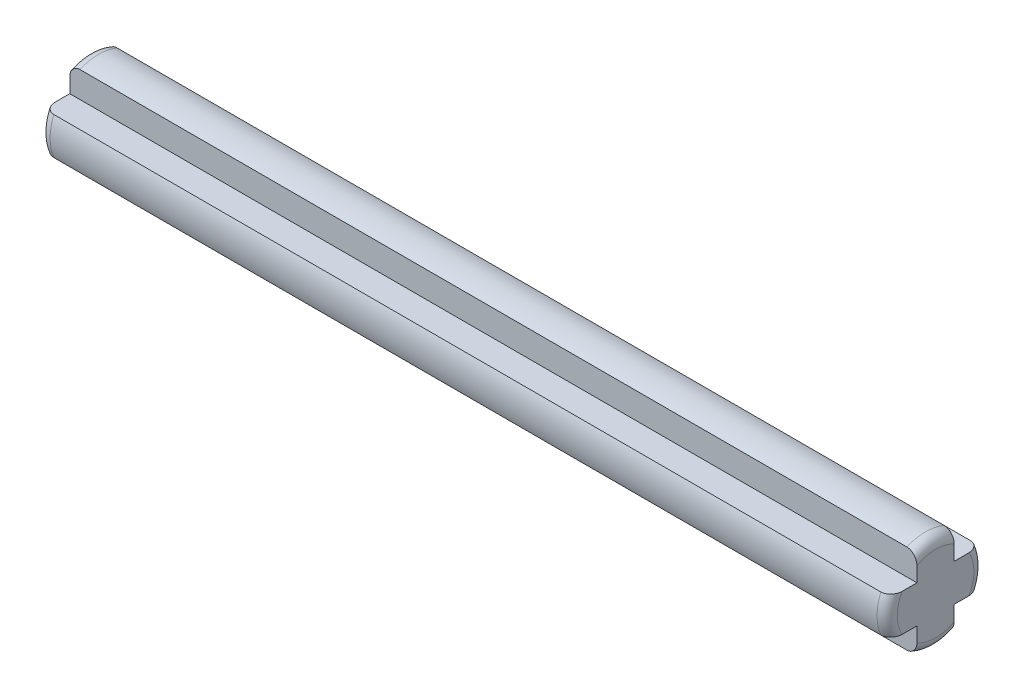
ISO-10303-21;
HEADER;
FILE_DESCRIPTION(('STEP AP214'),'2;1');
FILE_NAME('part.step','',(''),(''),'','','');
FILE_SCHEMA(('AUTOMOTIVE_DESIGN { 1 0 10303 214 1 1 1 1 }'));
ENDSEC;
DATA;
#1=APPLICATION_CONTEXT('core data for automotive mechanical design processes');
#2=APPLICATION_PROTOCOL_DEFINITION('international standard','automotive_design',2000,#1);
#3=PRODUCT_CONTEXT('',#1,'mechanical');
#4=PRODUCT('Part','Part','',(#3));
#5=PRODUCT_RELATED_PRODUCT_CATEGORY('part','',(#4));
#6=PRODUCT_DEFINITION_FORMATION('','',#4);
#7=PRODUCT_DEFINITION_CONTEXT('part definition',#1,'design');
#8=PRODUCT_DEFINITION('design','',#6,#7);
#9=PRODUCT_DEFINITION_SHAPE('','',#8);
#10=(LENGTH_UNIT() NAMED_UNIT(*) SI_UNIT(.MILLI.,.METRE.));
#11=(NAMED_UNIT(*) PLANE_ANGLE_UNIT() SI_UNIT($,.RADIAN.));
#12=(NAMED_UNIT(*) SI_UNIT($,.STERADIAN.) SOLID_ANGLE_UNIT());
#13=UNCERTAINTY_MEASURE_WITH_UNIT(LENGTH_MEASURE(1.E-05),#10,'distance_accuracy_value','');
#14=(GEOMETRIC_REPRESENTATION_CONTEXT(3) GLOBAL_UNCERTAINTY_ASSIGNED_CONTEXT((#13)) GLOBAL_UNIT_ASSIGNED_CONTEXT((#10,
#11,#12)) REPRESENTATION_CONTEXT('',''));
#15=CARTESIAN_POINT('',(0.,0.,0.));
#16=DIRECTION('',(0.,0.,1.));
#17=DIRECTION('',(1.,0.,0.));
#18=AXIS2_PLACEMENT_3D('',#15,#16,#17);
#19=CARTESIAN_POINT('',(41.5,0.,0.));
#20=DIRECTION('',(1.,0.,0.));
#21=DIRECTION('',(0.,1.,0.));
#22=AXIS2_PLACEMENT_3D('',#19,#20,#21);
#23=TOROIDAL_SURFACE('',#22,1.9,0.5);
#24=CARTESIAN_POINT('',(41.5,-2.2145823534021,0.925));
#25=CARTESIAN_POINT('',(41.7036798991296,-2.2145823534021,0.925));
#26=CARTESIAN_POINT('',(41.8548300320378,-2.04164291184524,0.925));
#27=CARTESIAN_POINT('',(42.,-1.875545716248,0.925));
#28=CARTESIAN_POINT('',(42.,-1.65963098308027,0.925));
#29=B_SPLINE_CURVE_WITH_KNOTS('',2,(#24,#25,#26,#27,#28),.UNSPECIFIED.,.F.,.F.,(3,2,3),(0.,0.5,
1.),.UNSPECIFIED.);
#30=CARTESIAN_POINT('',(41.5,-2.2145823534021,0.925));
#31=VERTEX_POINT('',#30);
#32=CARTESIAN_POINT('',(42.,-1.65963098308028,0.925));
#33=VERTEX_POINT('',#32);
#34=EDGE_CURVE('E732',#31,#33,#29,.T.);
#35=ORIENTED_EDGE('',*,*,#34,.F.);
#36=CARTESIAN_POINT('',(41.5,0.,0.));
#37=DIRECTION('',(-1.,0.,0.));
#38=DIRECTION('',(0.,1.,0.));
#39=AXIS2_PLACEMENT_3D('',#36,#37,#38);
#40=CIRCLE('',#39,2.4);
#41=CARTESIAN_POINT('',(41.5,-2.2145823534021,-0.925));
#42=VERTEX_POINT('',#41);
#43=EDGE_CURVE('E808',#42,#31,#40,.T.);
#44=ORIENTED_EDGE('',*,*,#43,.F.);
#45=CARTESIAN_POINT('',(42.,-1.65963098308028,-0.925));
#46=CARTESIAN_POINT('',(42.,-1.87313664786722,-0.925));
#47=CARTESIAN_POINT('',(41.8550835363971,-2.04178590647879,-0.925));
#48=CARTESIAN_POINT('',(41.7066034884122,-2.21458235340213,-0.925));
#49=CARTESIAN_POINT('',(41.5,-2.21458235340213,-0.925));
#50=B_SPLINE_CURVE_WITH_KNOTS('',2,(#45,#46,#47,#48,#49),.UNSPECIFIED.,.F.,.F.,(3,2,3),(0.,0.5,
1.),.UNSPECIFIED.);
#51=CARTESIAN_POINT('',(42.,-1.65963098308028,-0.925));
#52=VERTEX_POINT('',#51);
#53=EDGE_CURVE('E876',#52,#42,#50,.T.);
#54=ORIENTED_EDGE('',*,*,#53,.F.);
#55=CARTESIAN_POINT('',(42.,0.,0.));
#56=DIRECTION('',(1.,0.,0.));
#57=DIRECTION('',(0.,1.,0.));
#58=AXIS2_PLACEMENT_3D('',#55,#56,#57);
#59=CIRCLE('',#58,1.9);
#60=EDGE_CURVE('E606',#33,#52,#59,.T.);
#61=ORIENTED_EDGE('',*,*,#60,.F.);
#62=EDGE_LOOP('',(#35,#44,#54,#61));
#63=FACE_BOUND('',#62,.T.);
#64=ADVANCED_FACE('F16',(#63),#23,.T.);
#65=CARTESIAN_POINT('',(41.5,0.,0.));
#66=DIRECTION('',(1.,0.,0.));
#67=DIRECTION('',(0.,1.,0.));
#68=AXIS2_PLACEMENT_3D('',#65,#66,#67);
#69=TOROIDAL_SURFACE('',#68,1.9,0.5);
#70=CARTESIAN_POINT('',(41.5,0.925,2.2145823534021));
#71=CARTESIAN_POINT('',(41.7036798991296,0.925,2.2145823534021));
#72=CARTESIAN_POINT('',(41.8548300320378,0.925,2.04164291184524));
#73=CARTESIAN_POINT('',(42.,0.925,1.875545716248));
#74=CARTESIAN_POINT('',(42.,0.925,1.65963098308027));
#75=B_SPLINE_CURVE_WITH_KNOTS('',2,(#70,#71,#72,#73,#74),.UNSPECIFIED.,.F.,.F.,(3,2,3),(0.,0.5,
1.),.UNSPECIFIED.);
#76=CARTESIAN_POINT('',(41.5,0.925,2.2145823534021));
#77=VERTEX_POINT('',#76);
#78=CARTESIAN_POINT('',(42.,0.925,1.65963098308027));
#79=VERTEX_POINT('',#78);
#80=EDGE_CURVE('E640',#77,#79,#75,.T.);
#81=ORIENTED_EDGE('',*,*,#80,.F.);
#82=CARTESIAN_POINT('',(41.5,0.,0.));
#83=DIRECTION('',(-1.,0.,0.));
#84=DIRECTION('',(0.,1.,0.));
#85=AXIS2_PLACEMENT_3D('',#82,#83,#84);
#86=CIRCLE('',#85,2.4);
#87=CARTESIAN_POINT('',(41.5,-0.925,2.2145823534021));
#88=VERTEX_POINT('',#87);
#89=EDGE_CURVE('E623',#88,#77,#86,.T.);
#90=ORIENTED_EDGE('',*,*,#89,.F.);
#91=CARTESIAN_POINT('',(42.,-0.925,1.65963098308027));
#92=CARTESIAN_POINT('',(42.,-0.925,1.87313664786717));
#93=CARTESIAN_POINT('',(41.8550835363971,-0.925,2.04178590647878));
#94=CARTESIAN_POINT('',(41.7066034884122,-0.925,2.21458235340213));
#95=CARTESIAN_POINT('',(41.5,-0.925,2.21458235340213));
#96=B_SPLINE_CURVE_WITH_KNOTS('',2,(#91,#92,#93,#94,#95),.UNSPECIFIED.,.F.,.F.,(3,2,3),(0.,0.5,
1.),.UNSPECIFIED.);
#97=CARTESIAN_POINT('',(42.,-0.925,1.65963098308027));
#98=VERTEX_POINT('',#97);
#99=EDGE_CURVE('E307',#98,#88,#96,.T.);
#100=ORIENTED_EDGE('',*,*,#99,.F.);
#101=CARTESIAN_POINT('',(42.,0.,0.));
#102=DIRECTION('',(1.,0.,0.));
#103=DIRECTION('',(0.,1.,0.));
#104=AXIS2_PLACEMENT_3D('',#101,#102,#103);
#105=CIRCLE('',#104,1.9);
#106=EDGE_CURVE('E39',#79,#98,#105,.T.);
#107=ORIENTED_EDGE('',*,*,#106,.F.);
#108=EDGE_LOOP('',(#81,#90,#100,#107));
#109=FACE_BOUND('',#108,.T.);
#110=ADVANCED_FACE('F671',(#109),#69,.T.);
#111=CARTESIAN_POINT('',(41.5,0.,0.));
#112=DIRECTION('',(1.,0.,0.));
#113=DIRECTION('',(0.,1.,0.));
#114=AXIS2_PLACEMENT_3D('',#111,#112,#113);
#115=TOROIDAL_SURFACE('',#114,1.9,0.5);
#116=CARTESIAN_POINT('',(41.5,2.2145823534021,-0.925));
#117=CARTESIAN_POINT('',(41.7036798991296,2.2145823534021,-0.925));
#118=CARTESIAN_POINT('',(41.8548300320378,2.04164291184524,-0.925));
#119=CARTESIAN_POINT('',(42.,1.875545716248,-0.925));
#120=CARTESIAN_POINT('',(42.,1.65963098308027,-0.925));
#121=B_SPLINE_CURVE_WITH_KNOTS('',2,(#116,#117,#118,#119,#120),.UNSPECIFIED.,.F.,.F.,(3,2,3),
(0.,0.5,1.),.UNSPECIFIED.);
#122=CARTESIAN_POINT('',(41.5,2.2145823534021,-0.925));
#123=VERTEX_POINT('',#122);
#124=CARTESIAN_POINT('',(42.,1.65963098308027,-0.925));
#125=VERTEX_POINT('',#124);
#126=EDGE_CURVE('E411',#123,#125,#121,.T.);
#127=ORIENTED_EDGE('',*,*,#126,.F.);
#128=CARTESIAN_POINT('',(41.5,0.,0.));
#129=DIRECTION('',(-1.,0.,0.));
#130=DIRECTION('',(0.,1.,0.));
#131=AXIS2_PLACEMENT_3D('',#128,#129,#130);
#132=CIRCLE('',#131,2.4);
#133=CARTESIAN_POINT('',(41.5,2.2145823534021,0.925));
#134=VERTEX_POINT('',#133);
#135=EDGE_CURVE('E443',#134,#123,#132,.T.);
#136=ORIENTED_EDGE('',*,*,#135,.F.);
#137=CARTESIAN_POINT('',(42.,1.65963098308027,0.925));
#138=CARTESIAN_POINT('',(42.,1.87313664786717,0.925));
#139=CARTESIAN_POINT('',(41.8550835363971,2.04178590647878,0.925));
#140=CARTESIAN_POINT('',(41.7066034884122,2.21458235340213,0.925));
#141=CARTESIAN_POINT('',(41.5,2.21458235340213,0.925));
#142=B_SPLINE_CURVE_WITH_KNOTS('',2,(#137,#138,#139,#140,#141),.UNSPECIFIED.,.F.,.F.,(3,2,3),
(0.,0.5,1.),.UNSPECIFIED.);
#143=CARTESIAN_POINT('',(42.,1.65963098308027,0.925));
#144=VERTEX_POINT('',#143);
#145=EDGE_CURVE('E504',#144,#134,#142,.T.);
#146=ORIENTED_EDGE('',*,*,#145,.F.);
#147=CARTESIAN_POINT('',(42.,0.,0.));
#148=DIRECTION('',(1.,0.,0.));
#149=DIRECTION('',(0.,1.,0.));
#150=AXIS2_PLACEMENT_3D('',#147,#148,#149);
#151=CIRCLE('',#150,1.9);
#152=EDGE_CURVE('E306',#125,#144,#151,.T.);
#153=ORIENTED_EDGE('',*,*,#152,.F.);
#154=EDGE_LOOP('',(#127,#136,#146,#153));
#155=FACE_BOUND('',#154,.T.);
#156=ADVANCED_FACE('F285',(#155),#115,.T.);
#157=CARTESIAN_POINT('',(41.5,0.,0.));
#158=DIRECTION('',(1.,0.,0.));
#159=DIRECTION('',(0.,1.,0.));
#160=AXIS2_PLACEMENT_3D('',#157,#158,#159);
#161=TOROIDAL_SURFACE('',#160,1.9,0.5);
#162=CARTESIAN_POINT('',(41.5,-0.925,-2.2145823534021));
#163=CARTESIAN_POINT('',(41.7036798991296,-0.925,-2.2145823534021));
#164=CARTESIAN_POINT('',(41.8548300320378,-0.925,-2.04164291184524));
#165=CARTESIAN_POINT('',(42.,-0.925,-1.875545716248));
#166=CARTESIAN_POINT('',(42.,-0.925,-1.65963098308027));
#167=B_SPLINE_CURVE_WITH_KNOTS('',2,(#162,#163,#164,#165,#166),.UNSPECIFIED.,.F.,.F.,(3,2,3),
(0.,0.5,1.),.UNSPECIFIED.);
#168=CARTESIAN_POINT('',(41.5,-0.925,-2.2145823534021));
#169=VERTEX_POINT('',#168);
#170=CARTESIAN_POINT('',(42.,-0.925,-1.65963098308027));
#171=VERTEX_POINT('',#170);
#172=EDGE_CURVE('E227',#169,#171,#167,.T.);
#173=ORIENTED_EDGE('',*,*,#172,.F.);
#174=CARTESIAN_POINT('',(41.5,0.,0.));
#175=DIRECTION('',(-1.,0.,0.));
#176=DIRECTION('',(0.,1.,0.));
#177=AXIS2_PLACEMENT_3D('',#174,#175,#176);
#178=CIRCLE('',#177,2.4);
#179=CARTESIAN_POINT('',(41.5,0.925,-2.2145823534021));
#180=VERTEX_POINT('',#179);
#181=EDGE_CURVE('E222',#180,#169,#178,.T.);
#182=ORIENTED_EDGE('',*,*,#181,.F.);
#183=CARTESIAN_POINT('',(42.,0.925,-1.65963098308027));
#184=CARTESIAN_POINT('',(42.,0.925,-1.87313664786717));
#185=CARTESIAN_POINT('',(41.8550835363971,0.925,-2.04178590647878));
#186=CARTESIAN_POINT('',(41.7066034884122,0.925,-2.21458235340213));
#187=CARTESIAN_POINT('',(41.5,0.925,-2.21458235340213));
#188=B_SPLINE_CURVE_WITH_KNOTS('',2,(#183,#184,#185,#186,#187),.UNSPECIFIED.,.F.,.F.,(3,2,3),
(0.,0.5,1.),.UNSPECIFIED.);
#189=CARTESIAN_POINT('',(42.,0.925,-1.65963098308027));
#190=VERTEX_POINT('',#189);
#191=EDGE_CURVE('E314',#190,#180,#188,.T.);
#192=ORIENTED_EDGE('',*,*,#191,.F.);
#193=CARTESIAN_POINT('',(42.,0.,0.));
#194=DIRECTION('',(1.,0.,0.));
#195=DIRECTION('',(0.,1.,0.));
#196=AXIS2_PLACEMENT_3D('',#193,#194,#195);
#197=CIRCLE('',#196,1.9);
#198=EDGE_CURVE('E298',#171,#190,#197,.T.);
#199=ORIENTED_EDGE('',*,*,#198,.F.);
#200=EDGE_LOOP('',(#173,#182,#192,#199));
#201=FACE_BOUND('',#200,.T.);
#202=ADVANCED_FACE('F275',(#201),#161,.T.);
#203=CARTESIAN_POINT('',(0.5,0.,0.));
#204=DIRECTION('',(1.,0.,0.));
#205=DIRECTION('',(0.,1.,0.));
#206=AXIS2_PLACEMENT_3D('',#203,#204,#205);
#207=TOROIDAL_SURFACE('',#206,1.9,0.5);
#208=CARTESIAN_POINT('',(0.,-0.925,-1.65963098308027));
#209=CARTESIAN_POINT('',(0.,-0.925,-1.87313664786714));
#210=CARTESIAN_POINT('',(0.144916463602852,-0.925,-2.04178590647878));
#211=CARTESIAN_POINT('',(0.293396511587753,-0.925,-2.21458235340213));
#212=CARTESIAN_POINT('',(0.5,-0.925,-2.21458235340213));
#213=B_SPLINE_CURVE_WITH_KNOTS('',2,(#208,#209,#210,#211,#212),.UNSPECIFIED.,.F.,.F.,(3,2,3),
(0.,0.5,1.),.UNSPECIFIED.);
#214=CARTESIAN_POINT('',(0.,-0.925,-1.65963098308027));
#215=VERTEX_POINT('',#214);
#216=CARTESIAN_POINT('',(0.500000000000007,-0.925,-2.2145823534021));
#217=VERTEX_POINT('',#216);
#218=EDGE_CURVE('E205',#215,#217,#213,.T.);
#219=ORIENTED_EDGE('',*,*,#218,.F.);
#220=CARTESIAN_POINT('',(0.,0.,0.));
#221=DIRECTION('',(-1.,0.,0.));
#222=DIRECTION('',(0.,1.,0.));
#223=AXIS2_PLACEMENT_3D('',#220,#221,#222);
#224=CIRCLE('',#223,1.9);
#225=CARTESIAN_POINT('',(0.,0.925,-1.65963098308027));
#226=VERTEX_POINT('',#225);
#227=EDGE_CURVE('E10',#226,#215,#224,.T.);
#228=ORIENTED_EDGE('',*,*,#227,.F.);
#229=CARTESIAN_POINT('',(0.5,0.925,-2.2145823534021));
#230=CARTESIAN_POINT('',(0.296320100870356,0.925,-2.2145823534021));
#231=CARTESIAN_POINT('',(0.145169967962148,0.925,-2.04164291184524));
#232=CARTESIAN_POINT('',(0.,0.925,-1.87554571624801));
#233=CARTESIAN_POINT('',(0.,0.925,-1.65963098308027));
#234=B_SPLINE_CURVE_WITH_KNOTS('',2,(#229,#230,#231,#232,#233),.UNSPECIFIED.,.F.,.F.,(3,2,3),
(0.,0.5,1.),.UNSPECIFIED.);
#235=CARTESIAN_POINT('',(0.500000000000007,0.925,-2.2145823534021));
#236=VERTEX_POINT('',#235);
#237=EDGE_CURVE('E209',#236,#226,#234,.T.);
#238=ORIENTED_EDGE('',*,*,#237,.F.);
#239=CARTESIAN_POINT('',(0.499999999999994,0.,0.));
#240=DIRECTION('',(1.,0.,0.));
#241=DIRECTION('',(0.,1.,0.));
#242=AXIS2_PLACEMENT_3D('',#239,#240,#241);
#243=CIRCLE('',#242,2.4);
#244=EDGE_CURVE('E201',#217,#236,#243,.T.);
#245=ORIENTED_EDGE('',*,*,#244,.F.);
#246=EDGE_LOOP('',(#219,#228,#238,#245));
#247=FACE_BOUND('',#246,.T.);
#248=ADVANCED_FACE('F203',(#247),#207,.T.);
#249=CARTESIAN_POINT('',(0.5,0.,0.));
#250=DIRECTION('',(1.,0.,0.));
#251=DIRECTION('',(0.,1.,0.));
#252=AXIS2_PLACEMENT_3D('',#249,#250,#251);
#253=TOROIDAL_SURFACE('',#252,1.9,0.5);
#254=CARTESIAN_POINT('',(0.,1.65963098308027,-0.925));
#255=CARTESIAN_POINT('',(0.,1.87313664786714,-0.925));
#256=CARTESIAN_POINT('',(0.144916463602852,2.04178590647878,-0.925));
#257=CARTESIAN_POINT('',(0.293396511587753,2.21458235340213,-0.925));
#258=CARTESIAN_POINT('',(0.5,2.21458235340213,-0.925));
#259=B_SPLINE_CURVE_WITH_KNOTS('',2,(#254,#255,#256,#257,#258),.UNSPECIFIED.,.F.,.F.,(3,2,3),
(0.,0.5,1.),.UNSPECIFIED.);
#260=CARTESIAN_POINT('',(0.,1.65963098308027,-0.925));
#261=VERTEX_POINT('',#260);
#262=CARTESIAN_POINT('',(0.500000000000007,2.2145823534021,-0.925));
#263=VERTEX_POINT('',#262);
#264=EDGE_CURVE('E362',#261,#263,#259,.T.);
#265=ORIENTED_EDGE('',*,*,#264,.F.);
#266=CARTESIAN_POINT('',(0.,0.,0.));
#267=DIRECTION('',(-1.,0.,0.));
#268=DIRECTION('',(0.,1.,0.));
#269=AXIS2_PLACEMENT_3D('',#266,#267,#268);
#270=CIRCLE('',#269,1.9);
#271=CARTESIAN_POINT('',(0.,1.65963098308027,0.925));
#272=VERTEX_POINT('',#271);
#273=EDGE_CURVE('E26',#272,#261,#270,.T.);
#274=ORIENTED_EDGE('',*,*,#273,.F.);
#275=CARTESIAN_POINT('',(0.5,2.2145823534021,0.925));
#276=CARTESIAN_POINT('',(0.296320100870356,2.2145823534021,0.925));
#277=CARTESIAN_POINT('',(0.145169967962148,2.04164291184524,0.925));
#278=CARTESIAN_POINT('',(0.,1.87554571624801,0.925));
#279=CARTESIAN_POINT('',(0.,1.65963098308027,0.925));
#280=B_SPLINE_CURVE_WITH_KNOTS('',2,(#275,#276,#277,#278,#279),.UNSPECIFIED.,.F.,.F.,(3,2,3),
(0.,0.5,1.),.UNSPECIFIED.);
#281=CARTESIAN_POINT('',(0.500000000000007,2.2145823534021,0.925));
#282=VERTEX_POINT('',#281);
#283=EDGE_CURVE('E447',#282,#272,#280,.T.);
#284=ORIENTED_EDGE('',*,*,#283,.F.);
#285=CARTESIAN_POINT('',(0.499999999999994,0.,0.));
#286=DIRECTION('',(1.,0.,0.));
#287=DIRECTION('',(0.,1.,0.));
#288=AXIS2_PLACEMENT_3D('',#285,#286,#287);
#289=CIRCLE('',#288,2.4);
#290=EDGE_CURVE('E430',#263,#282,#289,.T.);
#291=ORIENTED_EDGE('',*,*,#290,.F.);
#292=EDGE_LOOP('',(#265,#274,#284,#291));
#293=FACE_BOUND('',#292,.T.);
#294=ADVANCED_FACE('F286',(#293),#253,.T.);
#295=CARTESIAN_POINT('',(0.5,0.,0.));
#296=DIRECTION('',(1.,0.,0.));
#297=DIRECTION('',(0.,1.,0.));
#298=AXIS2_PLACEMENT_3D('',#295,#296,#297);
#299=TOROIDAL_SURFACE('',#298,1.9,0.5);
#300=CARTESIAN_POINT('',(0.,0.925,1.65963098308027));
#301=CARTESIAN_POINT('',(0.,0.925,1.87313664786714));
#302=CARTESIAN_POINT('',(0.144916463602852,0.925,2.04178590647878));
#303=CARTESIAN_POINT('',(0.293396511587753,0.925,2.21458235340213));
#304=CARTESIAN_POINT('',(0.5,0.925,2.21458235340213));
#305=B_SPLINE_CURVE_WITH_KNOTS('',2,(#300,#301,#302,#303,#304),.UNSPECIFIED.,.F.,.F.,(3,2,3),
(0.,0.5,1.),.UNSPECIFIED.);
#306=CARTESIAN_POINT('',(0.,0.925,1.65963098308027));
#307=VERTEX_POINT('',#306);
#308=CARTESIAN_POINT('',(0.500000000000007,0.925,2.2145823534021));
#309=VERTEX_POINT('',#308);
#310=EDGE_CURVE('E579',#307,#309,#305,.T.);
#311=ORIENTED_EDGE('',*,*,#310,.F.);
#312=CARTESIAN_POINT('',(0.,0.,0.));
#313=DIRECTION('',(-1.,0.,0.));
#314=DIRECTION('',(0.,1.,0.));
#315=AXIS2_PLACEMENT_3D('',#312,#313,#314);
#316=CIRCLE('',#315,1.9);
#317=CARTESIAN_POINT('',(0.,-0.925,1.65963098308027));
#318=VERTEX_POINT('',#317);
#319=EDGE_CURVE('E49',#318,#307,#316,.T.);
#320=ORIENTED_EDGE('',*,*,#319,.F.);
#321=CARTESIAN_POINT('',(0.5,-0.925,2.2145823534021));
#322=CARTESIAN_POINT('',(0.296320100870356,-0.925,2.2145823534021));
#323=CARTESIAN_POINT('',(0.145169967962148,-0.925,2.04164291184524));
#324=CARTESIAN_POINT('',(0.,-0.925,1.87554571624801));
#325=CARTESIAN_POINT('',(0.,-0.925,1.65963098308027));
#326=B_SPLINE_CURVE_WITH_KNOTS('',2,(#321,#322,#323,#324,#325),.UNSPECIFIED.,.F.,.F.,(3,2,3),
(0.,0.5,1.),.UNSPECIFIED.);
#327=CARTESIAN_POINT('',(0.500000000000007,-0.925,2.2145823534021));
#328=VERTEX_POINT('',#327);
#329=EDGE_CURVE('E546',#328,#318,#326,.T.);
#330=ORIENTED_EDGE('',*,*,#329,.F.);
#331=CARTESIAN_POINT('',(0.499999999999994,0.,0.));
#332=DIRECTION('',(1.,0.,0.));
#333=DIRECTION('',(0.,1.,0.));
#334=AXIS2_PLACEMENT_3D('',#331,#332,#333);
#335=CIRCLE('',#334,2.4);
#336=EDGE_CURVE('E550',#309,#328,#335,.T.);
#337=ORIENTED_EDGE('',*,*,#336,.F.);
#338=EDGE_LOOP('',(#311,#320,#330,#337));
#339=FACE_BOUND('',#338,.T.);
#340=ADVANCED_FACE('F552',(#339),#299,.T.);
#341=CARTESIAN_POINT('',(0.5,0.,0.));
#342=DIRECTION('',(1.,0.,0.));
#343=DIRECTION('',(0.,1.,0.));
#344=AXIS2_PLACEMENT_3D('',#341,#342,#343);
#345=TOROIDAL_SURFACE('',#344,1.9,0.5);
#346=CARTESIAN_POINT('',(0.,-1.65963098308028,0.925));
#347=CARTESIAN_POINT('',(0.,-1.87313664786714,0.925));
#348=CARTESIAN_POINT('',(0.144916463602852,-2.04178590647879,0.925));
#349=CARTESIAN_POINT('',(0.293396511587753,-2.21458235340213,0.925));
#350=CARTESIAN_POINT('',(0.5,-2.21458235340213,0.925));
#351=B_SPLINE_CURVE_WITH_KNOTS('',2,(#346,#347,#348,#349,#350),.UNSPECIFIED.,.F.,.F.,(3,2,3),
(0.,0.5,1.),.UNSPECIFIED.);
#352=CARTESIAN_POINT('',(0.,-1.65963098308028,0.925));
#353=VERTEX_POINT('',#352);
#354=CARTESIAN_POINT('',(0.500000000000007,-2.2145823534021,0.925));
#355=VERTEX_POINT('',#354);
#356=EDGE_CURVE('E755',#353,#355,#351,.T.);
#357=ORIENTED_EDGE('',*,*,#356,.F.);
#358=CARTESIAN_POINT('',(0.,0.,0.));
#359=DIRECTION('',(-1.,0.,0.));
#360=DIRECTION('',(0.,1.,0.));
#361=AXIS2_PLACEMENT_3D('',#358,#359,#360);
#362=CIRCLE('',#361,1.9);
#363=CARTESIAN_POINT('',(0.,-1.65963098308028,-0.925));
#364=VERTEX_POINT('',#363);
#365=EDGE_CURVE('E610',#364,#353,#362,.T.);
#366=ORIENTED_EDGE('',*,*,#365,.F.);
#367=CARTESIAN_POINT('',(0.5,-2.2145823534021,-0.925));
#368=CARTESIAN_POINT('',(0.296320100870356,-2.2145823534021,-0.925));
#369=CARTESIAN_POINT('',(0.145169967962148,-2.04164291184524,-0.925));
#370=CARTESIAN_POINT('',(0.,-1.87554571624801,-0.925));
#371=CARTESIAN_POINT('',(0.,-1.65963098308027,-0.925));
#372=B_SPLINE_CURVE_WITH_KNOTS('',2,(#367,#368,#369,#370,#371),.UNSPECIFIED.,.F.,.F.,(3,2,3),
(0.,0.5,1.),.UNSPECIFIED.);
#373=CARTESIAN_POINT('',(0.500000000000007,-2.2145823534021,-0.925));
#374=VERTEX_POINT('',#373);
#375=EDGE_CURVE('E723',#374,#364,#372,.T.);
#376=ORIENTED_EDGE('',*,*,#375,.F.);
#377=CARTESIAN_POINT('',(0.499999999999994,0.,0.));
#378=DIRECTION('',(1.,0.,0.));
#379=DIRECTION('',(0.,1.,0.));
#380=AXIS2_PLACEMENT_3D('',#377,#378,#379);
#381=CIRCLE('',#380,2.4);
#382=EDGE_CURVE('E793',#355,#374,#381,.T.);
#383=ORIENTED_EDGE('',*,*,#382,.F.);
#384=EDGE_LOOP('',(#357,#366,#376,#383));
#385=FACE_BOUND('',#384,.T.);
#386=ADVANCED_FACE('F561',(#385),#345,.T.);
#387=CARTESIAN_POINT('',(0.,0.,0.));
#388=DIRECTION('',(1.,0.,0.));
#389=DIRECTION('',(0.,1.,0.));
#390=AXIS2_PLACEMENT_3D('',#387,#388,#389);
#391=PLANE('',#390);
#392=DIRECTION('',(0.,1.,0.));
#393=VECTOR('',#392,1.);
#394=CARTESIAN_POINT('',(0.,-2.2145823534021,-0.925));
#395=LINE('',#394,#393);
#396=CARTESIAN_POINT('',(0.,-0.925,-0.925));
#397=VERTEX_POINT('',#396);
#398=EDGE_CURVE('E718',#364,#397,#395,.T.);
#399=ORIENTED_EDGE('',*,*,#398,.F.);
#400=ORIENTED_EDGE('',*,*,#365,.T.);
#401=DIRECTION('',(0.,-1.,0.));
#402=VECTOR('',#401,1.);
#403=CARTESIAN_POINT('',(0.,-2.2145823534021,0.925));
#404=LINE('',#403,#402);
#405=CARTESIAN_POINT('',(0.,-0.925,0.925));
#406=VERTEX_POINT('',#405);
#407=EDGE_CURVE('E779',#406,#353,#404,.T.);
#408=ORIENTED_EDGE('',*,*,#407,.F.);
#409=DIRECTION('',(0.,0.,-1.));
#410=VECTOR('',#409,1.);
#411=CARTESIAN_POINT('',(0.,-0.925,0.925));
#412=LINE('',#411,#410);
#413=EDGE_CURVE('E620',#318,#406,#412,.T.);
#414=ORIENTED_EDGE('',*,*,#413,.F.);
#415=ORIENTED_EDGE('',*,*,#319,.T.);
#416=DIRECTION('',(0.,0.,1.));
#417=VECTOR('',#416,1.);
#418=CARTESIAN_POINT('',(0.,0.925,0.925));
#419=LINE('',#418,#417);
#420=CARTESIAN_POINT('',(0.,0.925,0.925));
#421=VERTEX_POINT('',#420);
#422=EDGE_CURVE('E571',#421,#307,#419,.T.);
#423=ORIENTED_EDGE('',*,*,#422,.F.);
#424=DIRECTION('',(0.,-1.,0.));
#425=VECTOR('',#424,1.);
#426=CARTESIAN_POINT('',(0.,0.925,0.925));
#427=LINE('',#426,#425);
#428=EDGE_CURVE('E453',#272,#421,#427,.T.);
#429=ORIENTED_EDGE('',*,*,#428,.F.);
#430=ORIENTED_EDGE('',*,*,#273,.T.);
#431=DIRECTION('',(0.,1.,0.));
#432=VECTOR('',#431,1.);
#433=CARTESIAN_POINT('',(0.,0.925,-0.925));
#434=LINE('',#433,#432);
#435=CARTESIAN_POINT('',(0.,0.925,-0.925));
#436=VERTEX_POINT('',#435);
#437=EDGE_CURVE('E358',#436,#261,#434,.T.);
#438=ORIENTED_EDGE('',*,*,#437,.F.);
#439=DIRECTION('',(0.,0.,1.));
#440=VECTOR('',#439,1.);
#441=CARTESIAN_POINT('',(0.,0.925,-2.2145823534021));
#442=LINE('',#441,#440);
#443=EDGE_CURVE('E927',#226,#436,#442,.T.);
#444=ORIENTED_EDGE('',*,*,#443,.F.);
#445=ORIENTED_EDGE('',*,*,#227,.T.);
#446=DIRECTION('',(0.,0.,-1.));
#447=VECTOR('',#446,1.);
#448=CARTESIAN_POINT('',(0.,-0.925,-2.2145823534021));
#449=LINE('',#448,#447);
#450=EDGE_CURVE('E232',#397,#215,#449,.T.);
#451=ORIENTED_EDGE('',*,*,#450,.F.);
#452=EDGE_LOOP('',(#399,#400,#408,#414,#415,#423,#429,#430,#438,#444,#445,#451));
#453=FACE_BOUND('',#452,.T.);
#454=ADVANCED_FACE('F562',(#453),#391,.F.);
#455=CARTESIAN_POINT('',(42.,0.,0.));
#456=DIRECTION('',(1.,0.,0.));
#457=DIRECTION('',(0.,1.,0.));
#458=AXIS2_PLACEMENT_3D('',#455,#456,#457);
#459=PLANE('',#458);
#460=DIRECTION('',(0.,0.,-1.));
#461=VECTOR('',#460,1.);
#462=CARTESIAN_POINT('',(42.,-0.925,-2.2145823534021));
#463=LINE('',#462,#461);
#464=CARTESIAN_POINT('',(42.,-0.925,-0.925));
#465=VERTEX_POINT('',#464);
#466=EDGE_CURVE('E216',#465,#171,#463,.T.);
#467=ORIENTED_EDGE('',*,*,#466,.T.);
#468=ORIENTED_EDGE('',*,*,#198,.T.);
#469=DIRECTION('',(0.,0.,1.));
#470=VECTOR('',#469,1.);
#471=CARTESIAN_POINT('',(42.,0.925,-2.2145823534021));
#472=LINE('',#471,#470);
#473=CARTESIAN_POINT('',(42.,0.925,-0.925));
#474=VERTEX_POINT('',#473);
#475=EDGE_CURVE('E310',#190,#474,#472,.T.);
#476=ORIENTED_EDGE('',*,*,#475,.T.);
#477=DIRECTION('',(0.,1.,0.));
#478=VECTOR('',#477,1.);
#479=CARTESIAN_POINT('',(42.,0.925,-0.925));
#480=LINE('',#479,#478);
#481=EDGE_CURVE('E427',#474,#125,#480,.T.);
#482=ORIENTED_EDGE('',*,*,#481,.T.);
#483=ORIENTED_EDGE('',*,*,#152,.T.);
#484=DIRECTION('',(0.,-1.,0.));
#485=VECTOR('',#484,1.);
#486=CARTESIAN_POINT('',(42.,0.925,0.925));
#487=LINE('',#486,#485);
#488=CARTESIAN_POINT('',(42.,0.925,0.925));
#489=VERTEX_POINT('',#488);
#490=EDGE_CURVE('E497',#144,#489,#487,.T.);
#491=ORIENTED_EDGE('',*,*,#490,.T.);
#492=DIRECTION('',(0.,0.,1.));
#493=VECTOR('',#492,1.);
#494=CARTESIAN_POINT('',(42.,0.925,0.925));
#495=LINE('',#494,#493);
#496=EDGE_CURVE('E635',#489,#79,#495,.T.);
#497=ORIENTED_EDGE('',*,*,#496,.T.);
#498=ORIENTED_EDGE('',*,*,#106,.T.);
#499=DIRECTION('',(0.,0.,-1.));
#500=VECTOR('',#499,1.);
#501=CARTESIAN_POINT('',(42.,-0.925,0.925));
#502=LINE('',#501,#500);
#503=CARTESIAN_POINT('',(42.,-0.925,0.925));
#504=VERTEX_POINT('',#503);
#505=EDGE_CURVE('E617',#98,#504,#502,.T.);
#506=ORIENTED_EDGE('',*,*,#505,.T.);
#507=DIRECTION('',(0.,-1.,0.));
#508=VECTOR('',#507,1.);
#509=CARTESIAN_POINT('',(42.,-2.2145823534021,0.925));
#510=LINE('',#509,#508);
#511=EDGE_CURVE('E758',#504,#33,#510,.T.);
#512=ORIENTED_EDGE('',*,*,#511,.T.);
#513=ORIENTED_EDGE('',*,*,#60,.T.);
#514=DIRECTION('',(0.,1.,0.));
#515=VECTOR('',#514,1.);
#516=CARTESIAN_POINT('',(42.,-2.2145823534021,-0.925));
#517=LINE('',#516,#515);
#518=EDGE_CURVE('E869',#52,#465,#517,.T.);
#519=ORIENTED_EDGE('',*,*,#518,.T.);
#520=EDGE_LOOP('',(#467,#468,#476,#482,#483,#491,#497,#498,#506,#512,#513,#519));
#521=FACE_BOUND('',#520,.T.);
#522=ADVANCED_FACE('F529',(#521),#459,.T.);
#523=CARTESIAN_POINT('',(42.,-0.925,0.925));
#524=DIRECTION('',(0.,1.,0.));
#525=DIRECTION('',(0.,0.,-1.));
#526=AXIS2_PLACEMENT_3D('',#523,#524,#525);
#527=PLANE('',#526);
#528=DIRECTION('',(-1.,0.,0.));
#529=VECTOR('',#528,1.);
#530=CARTESIAN_POINT('',(42.,-0.925,2.2145823534021));
#531=LINE('',#530,#529);
#532=EDGE_CURVE('E626',#88,#328,#531,.T.);
#533=ORIENTED_EDGE('',*,*,#532,.T.);
#534=ORIENTED_EDGE('',*,*,#329,.T.);
#535=ORIENTED_EDGE('',*,*,#413,.T.);
#536=DIRECTION('',(-1.,0.,0.));
#537=VECTOR('',#536,1.);
#538=CARTESIAN_POINT('',(42.,-0.925,0.925));
#539=LINE('',#538,#537);
#540=EDGE_CURVE('E507',#504,#406,#539,.T.);
#541=ORIENTED_EDGE('',*,*,#540,.F.);
#542=ORIENTED_EDGE('',*,*,#505,.F.);
#543=ORIENTED_EDGE('',*,*,#99,.T.);
#544=EDGE_LOOP('',(#533,#534,#535,#541,#542,#543));
#545=FACE_BOUND('',#544,.T.);
#546=ADVANCED_FACE('F519',(#545),#527,.F.);
#547=CARTESIAN_POINT('',(42.,0.,0.));
#548=DIRECTION('',(-1.,0.,0.));
#549=DIRECTION('',(0.,-1.,0.));
#550=AXIS2_PLACEMENT_3D('',#547,#548,#549);
#551=CYLINDRICAL_SURFACE('',#550,2.4);
#552=DIRECTION('',(-1.,0.,0.));
#553=VECTOR('',#552,1.);
#554=CARTESIAN_POINT('',(42.,0.925,2.2145823534021));
#555=LINE('',#554,#553);
#556=EDGE_CURVE('E645',#77,#309,#555,.T.);
#557=ORIENTED_EDGE('',*,*,#556,.T.);
#558=ORIENTED_EDGE('',*,*,#336,.T.);
#559=ORIENTED_EDGE('',*,*,#532,.F.);
#560=ORIENTED_EDGE('',*,*,#89,.T.);
#561=EDGE_LOOP('',(#557,#558,#559,#560));
#562=FACE_BOUND('',#561,.T.);
#563=ADVANCED_FACE('F528',(#562),#551,.T.);
#564=CARTESIAN_POINT('',(42.,0.925,0.925));
#565=DIRECTION('',(0.,-1.,0.));
#566=DIRECTION('',(-1.,0.,0.));
#567=AXIS2_PLACEMENT_3D('',#564,#565,#566);
#568=PLANE('',#567);
#569=ORIENTED_EDGE('',*,*,#422,.T.);
#570=ORIENTED_EDGE('',*,*,#310,.T.);
#571=ORIENTED_EDGE('',*,*,#556,.F.);
#572=ORIENTED_EDGE('',*,*,#80,.T.);
#573=ORIENTED_EDGE('',*,*,#496,.F.);
#574=DIRECTION('',(-1.,0.,0.));
#575=VECTOR('',#574,1.);
#576=CARTESIAN_POINT('',(42.,0.925,0.925));
#577=LINE('',#576,#575);
#578=EDGE_CURVE('E490',#489,#421,#577,.T.);
#579=ORIENTED_EDGE('',*,*,#578,.T.);
#580=EDGE_LOOP('',(#569,#570,#571,#572,#573,#579));
#581=FACE_BOUND('',#580,.T.);
#582=ADVANCED_FACE('F254',(#581),#568,.F.);
#583=CARTESIAN_POINT('',(42.,0.925,0.925));
#584=DIRECTION('',(0.,0.,-1.));
#585=DIRECTION('',(0.,-1.,0.));
#586=AXIS2_PLACEMENT_3D('',#583,#584,#585);
#587=PLANE('',#586);
#588=DIRECTION('',(-1.,0.,0.));
#589=VECTOR('',#588,1.);
#590=CARTESIAN_POINT('',(42.,2.2145823534021,0.925));
#591=LINE('',#590,#589);
#592=EDGE_CURVE('E437',#134,#282,#591,.T.);
#593=ORIENTED_EDGE('',*,*,#592,.T.);
#594=ORIENTED_EDGE('',*,*,#283,.T.);
#595=ORIENTED_EDGE('',*,*,#428,.T.);
#596=ORIENTED_EDGE('',*,*,#578,.F.);
#597=ORIENTED_EDGE('',*,*,#490,.F.);
#598=ORIENTED_EDGE('',*,*,#145,.T.);
#599=EDGE_LOOP('',(#593,#594,#595,#596,#597,#598));
#600=FACE_BOUND('',#599,.T.);
#601=ADVANCED_FACE('F391',(#600),#587,.F.);
#602=CARTESIAN_POINT('',(42.,0.,0.));
#603=DIRECTION('',(-1.,0.,0.));
#604=DIRECTION('',(0.,-1.,0.));
#605=AXIS2_PLACEMENT_3D('',#602,#603,#604);
#606=CYLINDRICAL_SURFACE('',#605,2.4);
#607=DIRECTION('',(-1.,0.,0.));
#608=VECTOR('',#607,1.);
#609=CARTESIAN_POINT('',(42.,2.2145823534021,-0.925));
#610=LINE('',#609,#608);
#611=EDGE_CURVE('E416',#123,#263,#610,.T.);
#612=ORIENTED_EDGE('',*,*,#611,.T.);
#613=ORIENTED_EDGE('',*,*,#290,.T.);
#614=ORIENTED_EDGE('',*,*,#592,.F.);
#615=ORIENTED_EDGE('',*,*,#135,.T.);
#616=EDGE_LOOP('',(#612,#613,#614,#615));
#617=FACE_BOUND('',#616,.T.);
#618=ADVANCED_FACE('F389',(#617),#606,.T.);
#619=CARTESIAN_POINT('',(42.,0.925,-0.925));
#620=DIRECTION('',(0.,0.,1.));
#621=DIRECTION('',(1.,0.,0.));
#622=AXIS2_PLACEMENT_3D('',#619,#620,#621);
#623=PLANE('',#622);
#624=ORIENTED_EDGE('',*,*,#437,.T.);
#625=ORIENTED_EDGE('',*,*,#264,.T.);
#626=ORIENTED_EDGE('',*,*,#611,.F.);
#627=ORIENTED_EDGE('',*,*,#126,.T.);
#628=ORIENTED_EDGE('',*,*,#481,.F.);
#629=DIRECTION('',(-1.,0.,0.));
#630=VECTOR('',#629,1.);
#631=CARTESIAN_POINT('',(42.,0.925,-0.925));
#632=LINE('',#631,#630);
#633=EDGE_CURVE('E315',#474,#436,#632,.T.);
#634=ORIENTED_EDGE('',*,*,#633,.T.);
#635=EDGE_LOOP('',(#624,#625,#626,#627,#628,#634));
#636=FACE_BOUND('',#635,.T.);
#637=ADVANCED_FACE('F342',(#636),#623,.F.);
#638=CARTESIAN_POINT('',(42.,0.925,-2.2145823534021));
#639=DIRECTION('',(0.,-1.,0.));
#640=DIRECTION('',(-1.,0.,0.));
#641=AXIS2_PLACEMENT_3D('',#638,#639,#640);
#642=PLANE('',#641);
#643=DIRECTION('',(-1.,0.,0.));
#644=VECTOR('',#643,1.);
#645=CARTESIAN_POINT('',(42.,0.925,-2.2145823534021));
#646=LINE('',#645,#644);
#647=EDGE_CURVE('E215',#180,#236,#646,.T.);
#648=ORIENTED_EDGE('',*,*,#647,.T.);
#649=ORIENTED_EDGE('',*,*,#237,.T.);
#650=ORIENTED_EDGE('',*,*,#443,.T.);
#651=ORIENTED_EDGE('',*,*,#633,.F.);
#652=ORIENTED_EDGE('',*,*,#475,.F.);
#653=ORIENTED_EDGE('',*,*,#191,.T.);
#654=EDGE_LOOP('',(#648,#649,#650,#651,#652,#653));
#655=FACE_BOUND('',#654,.T.);
#656=ADVANCED_FACE('F333',(#655),#642,.F.);
#657=CARTESIAN_POINT('',(42.,0.,0.));
#658=DIRECTION('',(-1.,0.,0.));
#659=DIRECTION('',(0.,-1.,0.));
#660=AXIS2_PLACEMENT_3D('',#657,#658,#659);
#661=CYLINDRICAL_SURFACE('',#660,2.4);
#662=DIRECTION('',(-1.,0.,0.));
#663=VECTOR('',#662,1.);
#664=CARTESIAN_POINT('',(42.,-0.925,-2.2145823534021));
#665=LINE('',#664,#663);
#666=EDGE_CURVE('E219',#169,#217,#665,.T.);
#667=ORIENTED_EDGE('',*,*,#666,.T.);
#668=ORIENTED_EDGE('',*,*,#244,.T.);
#669=ORIENTED_EDGE('',*,*,#647,.F.);
#670=ORIENTED_EDGE('',*,*,#181,.T.);
#671=EDGE_LOOP('',(#667,#668,#669,#670));
#672=FACE_BOUND('',#671,.T.);
#673=ADVANCED_FACE('F220',(#672),#661,.T.);
#674=CARTESIAN_POINT('',(42.,-0.925,-2.2145823534021));
#675=DIRECTION('',(0.,1.,0.));
#676=DIRECTION('',(0.,0.,-1.));
#677=AXIS2_PLACEMENT_3D('',#674,#675,#676);
#678=PLANE('',#677);
#679=ORIENTED_EDGE('',*,*,#450,.T.);
#680=ORIENTED_EDGE('',*,*,#218,.T.);
#681=ORIENTED_EDGE('',*,*,#666,.F.);
#682=ORIENTED_EDGE('',*,*,#172,.T.);
#683=ORIENTED_EDGE('',*,*,#466,.F.);
#684=DIRECTION('',(-1.,0.,0.));
#685=VECTOR('',#684,1.);
#686=CARTESIAN_POINT('',(42.,-0.925,-0.925));
#687=LINE('',#686,#685);
#688=EDGE_CURVE('E722',#465,#397,#687,.T.);
#689=ORIENTED_EDGE('',*,*,#688,.T.);
#690=EDGE_LOOP('',(#679,#680,#681,#682,#683,#689));
#691=FACE_BOUND('',#690,.T.);
#692=ADVANCED_FACE('F230',(#691),#678,.F.);
#693=CARTESIAN_POINT('',(42.,-2.2145823534021,-0.925));
#694=DIRECTION('',(0.,0.,1.));
#695=DIRECTION('',(0.,-1.,0.));
#696=AXIS2_PLACEMENT_3D('',#693,#694,#695);
#697=PLANE('',#696);
#698=DIRECTION('',(-1.,0.,0.));
#699=VECTOR('',#698,1.);
#700=CARTESIAN_POINT('',(42.,-2.2145823534021,-0.925));
#701=LINE('',#700,#699);
#702=EDGE_CURVE('E801',#42,#374,#701,.T.);
#703=ORIENTED_EDGE('',*,*,#702,.T.);
#704=ORIENTED_EDGE('',*,*,#375,.T.);
#705=ORIENTED_EDGE('',*,*,#398,.T.);
#706=ORIENTED_EDGE('',*,*,#688,.F.);
#707=ORIENTED_EDGE('',*,*,#518,.F.);
#708=ORIENTED_EDGE('',*,*,#53,.T.);
#709=EDGE_LOOP('',(#703,#704,#705,#706,#707,#708));
#710=FACE_BOUND('',#709,.T.);
#711=ADVANCED_FACE('F251',(#710),#697,.F.);
#712=CARTESIAN_POINT('',(42.,0.,0.));
#713=DIRECTION('',(-1.,0.,0.));
#714=DIRECTION('',(0.,-1.,0.));
#715=AXIS2_PLACEMENT_3D('',#712,#713,#714);
#716=CYLINDRICAL_SURFACE('',#715,2.4);
#717=DIRECTION('',(-1.,0.,0.));
#718=VECTOR('',#717,1.);
#719=CARTESIAN_POINT('',(42.,-2.2145823534021,0.925));
#720=LINE('',#719,#718);
#721=EDGE_CURVE('E746',#31,#355,#720,.T.);
#722=ORIENTED_EDGE('',*,*,#721,.T.);
#723=ORIENTED_EDGE('',*,*,#382,.T.);
#724=ORIENTED_EDGE('',*,*,#702,.F.);
#725=ORIENTED_EDGE('',*,*,#43,.T.);
#726=EDGE_LOOP('',(#722,#723,#724,#725));
#727=FACE_BOUND('',#726,.T.);
#728=ADVANCED_FACE('F1169',(#727),#716,.T.);
#729=CARTESIAN_POINT('',(42.,-2.2145823534021,0.925));
#730=DIRECTION('',(0.,0.,-1.));
#731=DIRECTION('',(-1.,0.,0.));
#732=AXIS2_PLACEMENT_3D('',#729,#730,#731);
#733=PLANE('',#732);
#734=ORIENTED_EDGE('',*,*,#407,.T.);
#735=ORIENTED_EDGE('',*,*,#356,.T.);
#736=ORIENTED_EDGE('',*,*,#721,.F.);
#737=ORIENTED_EDGE('',*,*,#34,.T.);
#738=ORIENTED_EDGE('',*,*,#511,.F.);
#739=ORIENTED_EDGE('',*,*,#540,.T.);
#740=EDGE_LOOP('',(#734,#735,#736,#737,#738,#739));
#741=FACE_BOUND('',#740,.T.);
#742=ADVANCED_FACE('F343',(#741),#733,.F.);
#743=CLOSED_SHELL('',(#64,#110,#156,#202,#248,#294,#340,#386,#454,#522,#546,#563,#582,#601,#618,
#637,#656,#673,#692,#711,#728,#742));
#744=MANIFOLD_SOLID_BREP('B1',#743);
#745=ADVANCED_BREP_SHAPE_REPRESENTATION('',(#18,#744),#14);
#746=SHAPE_DEFINITION_REPRESENTATION(#9,#745);
ENDSEC;
END-ISO-10303-21;
